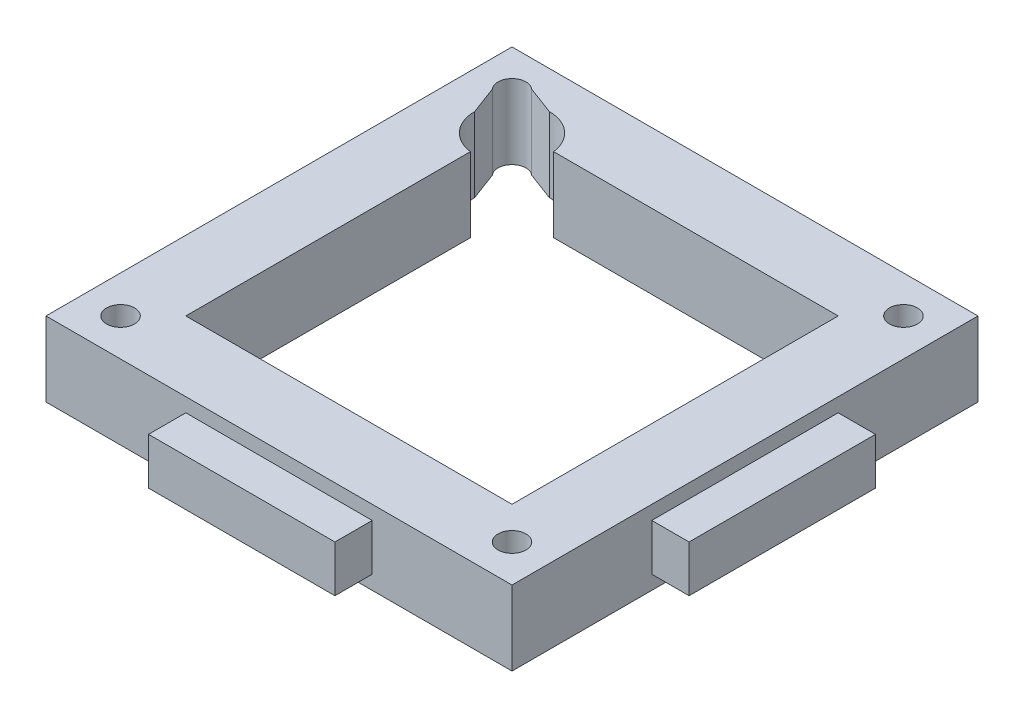
ISO-10303-21;
HEADER;
FILE_DESCRIPTION(('STEP AP214'),'2;1');
FILE_NAME('part.step','',(''),(''),'','','');
FILE_SCHEMA(('AUTOMOTIVE_DESIGN { 1 0 10303 214 1 1 1 1 }'));
ENDSEC;
DATA;
#1=APPLICATION_CONTEXT('core data for automotive mechanical design processes');
#2=APPLICATION_PROTOCOL_DEFINITION('international standard','automotive_design',2000,#1);
#3=PRODUCT_CONTEXT('',#1,'mechanical');
#4=PRODUCT('Part','Part','',(#3));
#5=PRODUCT_RELATED_PRODUCT_CATEGORY('part','',(#4));
#6=PRODUCT_DEFINITION_FORMATION('','',#4);
#7=PRODUCT_DEFINITION_CONTEXT('part definition',#1,'design');
#8=PRODUCT_DEFINITION('design','',#6,#7);
#9=PRODUCT_DEFINITION_SHAPE('','',#8);
#10=(LENGTH_UNIT() NAMED_UNIT(*) SI_UNIT(.MILLI.,.METRE.));
#11=(NAMED_UNIT(*) PLANE_ANGLE_UNIT() SI_UNIT($,.RADIAN.));
#12=(NAMED_UNIT(*) SI_UNIT($,.STERADIAN.) SOLID_ANGLE_UNIT());
#13=UNCERTAINTY_MEASURE_WITH_UNIT(LENGTH_MEASURE(1.E-05),#10,'distance_accuracy_value','');
#14=(GEOMETRIC_REPRESENTATION_CONTEXT(3) GLOBAL_UNCERTAINTY_ASSIGNED_CONTEXT((#13)) GLOBAL_UNIT_ASSIGNED_CONTEXT((#10,
#11,#12)) REPRESENTATION_CONTEXT('',''));
#15=CARTESIAN_POINT('',(0.,0.,0.));
#16=DIRECTION('',(0.,0.,1.));
#17=DIRECTION('',(1.,0.,0.));
#18=AXIS2_PLACEMENT_3D('',#15,#16,#17);
#19=CARTESIAN_POINT('',(25.,8.,0.));
#20=DIRECTION('',(-1.,0.,0.));
#21=DIRECTION('',(0.,0.,1.));
#22=AXIS2_PLACEMENT_3D('',#19,#20,#21);
#23=PLANE('',#22);
#24=DIRECTION('',(0.,0.,-1.));
#25=VECTOR('',#24,1.);
#26=CARTESIAN_POINT('',(25.,0.,0.));
#27=LINE('',#26,#25);
#28=CARTESIAN_POINT('',(25.,0.,25.));
#29=VERTEX_POINT('',#28);
#30=CARTESIAN_POINT('',(25.,0.,-25.));
#31=VERTEX_POINT('',#30);
#32=EDGE_CURVE('E370',#29,#31,#27,.T.);
#33=ORIENTED_EDGE('',*,*,#32,.T.);
#34=DIRECTION('',(0.,-1.,0.));
#35=VECTOR('',#34,1.);
#36=CARTESIAN_POINT('',(25.,8.,-25.));
#37=LINE('',#36,#35);
#38=CARTESIAN_POINT('',(25.,8.,-25.));
#39=VERTEX_POINT('',#38);
#40=EDGE_CURVE('E59',#39,#31,#37,.T.);
#41=ORIENTED_EDGE('',*,*,#40,.F.);
#42=DIRECTION('',(0.,0.,-1.));
#43=VECTOR('',#42,1.);
#44=CARTESIAN_POINT('',(25.,8.,0.));
#45=LINE('',#44,#43);
#46=CARTESIAN_POINT('',(25.,8.,25.));
#47=VERTEX_POINT('',#46);
#48=EDGE_CURVE('E310',#47,#39,#45,.T.);
#49=ORIENTED_EDGE('',*,*,#48,.F.);
#50=DIRECTION('',(0.,-1.,0.));
#51=VECTOR('',#50,1.);
#52=CARTESIAN_POINT('',(25.,8.,25.));
#53=LINE('',#52,#51);
#54=EDGE_CURVE('E11',#47,#29,#53,.T.);
#55=ORIENTED_EDGE('',*,*,#54,.T.);
#56=EDGE_LOOP('',(#33,#41,#49,#55));
#57=FACE_BOUND('',#56,.T.);
#58=DIRECTION('',(0.,0.,-1.));
#59=VECTOR('',#58,1.);
#60=CARTESIAN_POINT('',(25.,1.50000000000004,0.));
#61=LINE('',#60,#59);
#62=CARTESIAN_POINT('',(25.,1.5,10.));
#63=VERTEX_POINT('',#62);
#64=CARTESIAN_POINT('',(25.,1.50000000000007,-10.));
#65=VERTEX_POINT('',#64);
#66=EDGE_CURVE('E67',#63,#65,#61,.T.);
#67=ORIENTED_EDGE('',*,*,#66,.F.);
#68=DIRECTION('',(0.,-1.,0.));
#69=VECTOR('',#68,1.);
#70=CARTESIAN_POINT('',(25.,8.,10.));
#71=LINE('',#70,#69);
#72=CARTESIAN_POINT('',(25.,6.5,10.));
#73=VERTEX_POINT('',#72);
#74=EDGE_CURVE('E71',#73,#63,#71,.T.);
#75=ORIENTED_EDGE('',*,*,#74,.F.);
#76=DIRECTION('',(0.,0.,1.));
#77=VECTOR('',#76,1.);
#78=CARTESIAN_POINT('',(25.,6.5,0.));
#79=LINE('',#78,#77);
#80=CARTESIAN_POINT('',(25.,6.5,-10.));
#81=VERTEX_POINT('',#80);
#82=EDGE_CURVE('E858',#81,#73,#79,.T.);
#83=ORIENTED_EDGE('',*,*,#82,.F.);
#84=DIRECTION('',(0.,1.,0.));
#85=VECTOR('',#84,1.);
#86=CARTESIAN_POINT('',(25.,8.,-10.));
#87=LINE('',#86,#85);
#88=EDGE_CURVE('E868',#65,#81,#87,.T.);
#89=ORIENTED_EDGE('',*,*,#88,.F.);
#90=EDGE_LOOP('',(#67,#75,#83,#89));
#91=FACE_BOUND('',#90,.T.);
#92=ADVANCED_FACE('F49',(#57,#91),#23,.F.);
#93=CARTESIAN_POINT('',(0.,8.,25.));
#94=DIRECTION('',(0.,0.,-1.));
#95=DIRECTION('',(-1.,0.,0.));
#96=AXIS2_PLACEMENT_3D('',#93,#94,#95);
#97=PLANE('',#96);
#98=DIRECTION('',(1.,0.,0.));
#99=VECTOR('',#98,1.);
#100=CARTESIAN_POINT('',(0.,0.,25.));
#101=LINE('',#100,#99);
#102=CARTESIAN_POINT('',(-25.,0.,25.));
#103=VERTEX_POINT('',#102);
#104=EDGE_CURVE('E366',#103,#29,#101,.T.);
#105=ORIENTED_EDGE('',*,*,#104,.T.);
#106=ORIENTED_EDGE('',*,*,#54,.F.);
#107=DIRECTION('',(1.,0.,0.));
#108=VECTOR('',#107,1.);
#109=CARTESIAN_POINT('',(0.,8.,25.));
#110=LINE('',#109,#108);
#111=CARTESIAN_POINT('',(-25.,8.,25.));
#112=VERTEX_POINT('',#111);
#113=EDGE_CURVE('E306',#112,#47,#110,.T.);
#114=ORIENTED_EDGE('',*,*,#113,.F.);
#115=DIRECTION('',(0.,-1.,0.));
#116=VECTOR('',#115,1.);
#117=CARTESIAN_POINT('',(-25.,8.,25.));
#118=LINE('',#117,#116);
#119=EDGE_CURVE('E389',#112,#103,#118,.T.);
#120=ORIENTED_EDGE('',*,*,#119,.T.);
#121=EDGE_LOOP('',(#105,#106,#114,#120));
#122=FACE_BOUND('',#121,.T.);
#123=DIRECTION('',(1.,0.,0.));
#124=VECTOR('',#123,1.);
#125=CARTESIAN_POINT('',(0.,1.5000000000053,25.));
#126=LINE('',#125,#124);
#127=CARTESIAN_POINT('',(-10.0000000000553,1.5000000000053,25.));
#128=VERTEX_POINT('',#127);
#129=CARTESIAN_POINT('',(9.9999999999447,1.5000000000053,25.));
#130=VERTEX_POINT('',#129);
#131=EDGE_CURVE('E218',#128,#130,#126,.T.);
#132=ORIENTED_EDGE('',*,*,#131,.F.);
#133=DIRECTION('',(0.,-1.,0.));
#134=VECTOR('',#133,1.);
#135=CARTESIAN_POINT('',(-10.0000000000553,8.,25.));
#136=LINE('',#135,#134);
#137=CARTESIAN_POINT('',(-10.0000000000553,6.5000000000053,25.));
#138=VERTEX_POINT('',#137);
#139=EDGE_CURVE('E234',#138,#128,#136,.T.);
#140=ORIENTED_EDGE('',*,*,#139,.F.);
#141=DIRECTION('',(-1.,0.,0.));
#142=VECTOR('',#141,1.);
#143=CARTESIAN_POINT('',(0.,6.5000000000053,25.));
#144=LINE('',#143,#142);
#145=CARTESIAN_POINT('',(9.9999999999447,6.5000000000053,25.));
#146=VERTEX_POINT('',#145);
#147=EDGE_CURVE('E247',#146,#138,#144,.T.);
#148=ORIENTED_EDGE('',*,*,#147,.F.);
#149=DIRECTION('',(0.,1.,0.));
#150=VECTOR('',#149,1.);
#151=CARTESIAN_POINT('',(9.9999999999447,8.,25.));
#152=LINE('',#151,#150);
#153=EDGE_CURVE('E223',#130,#146,#152,.T.);
#154=ORIENTED_EDGE('',*,*,#153,.F.);
#155=EDGE_LOOP('',(#132,#140,#148,#154));
#156=FACE_BOUND('',#155,.T.);
#157=ADVANCED_FACE('F477',(#122,#156),#97,.F.);
#158=CARTESIAN_POINT('',(0.,8.,-25.));
#159=DIRECTION('',(0.,0.,-1.));
#160=DIRECTION('',(-1.,0.,0.));
#161=AXIS2_PLACEMENT_3D('',#158,#159,#160);
#162=PLANE('',#161);
#163=DIRECTION('',(1.,0.,0.));
#164=VECTOR('',#163,1.);
#165=CARTESIAN_POINT('',(0.,0.,-25.));
#166=LINE('',#165,#164);
#167=CARTESIAN_POINT('',(-25.,0.,-25.));
#168=VERTEX_POINT('',#167);
#169=EDGE_CURVE('E374',#168,#31,#166,.T.);
#170=ORIENTED_EDGE('',*,*,#169,.F.);
#171=DIRECTION('',(0.,-1.,0.));
#172=VECTOR('',#171,1.);
#173=CARTESIAN_POINT('',(-25.,8.,-25.));
#174=LINE('',#173,#172);
#175=CARTESIAN_POINT('',(-25.,8.,-25.));
#176=VERTEX_POINT('',#175);
#177=EDGE_CURVE('E392',#176,#168,#174,.T.);
#178=ORIENTED_EDGE('',*,*,#177,.F.);
#179=DIRECTION('',(1.,0.,0.));
#180=VECTOR('',#179,1.);
#181=CARTESIAN_POINT('',(0.,8.,-25.));
#182=LINE('',#181,#180);
#183=EDGE_CURVE('E313',#176,#39,#182,.T.);
#184=ORIENTED_EDGE('',*,*,#183,.T.);
#185=ORIENTED_EDGE('',*,*,#40,.T.);
#186=EDGE_LOOP('',(#170,#178,#184,#185));
#187=FACE_BOUND('',#186,.T.);
#188=ADVANCED_FACE('F475',(#187),#162,.T.);
#189=CARTESIAN_POINT('',(-17.,8.,-17.));
#190=DIRECTION('',(0.,-1.,0.));
#191=DIRECTION('',(0.,0.,-1.));
#192=AXIS2_PLACEMENT_3D('',#189,#190,#191);
#193=CYLINDRICAL_SURFACE('',#192,4.);
#194=CARTESIAN_POINT('',(-17.,0.,-17.));
#195=DIRECTION('',(0.,1.,0.));
#196=DIRECTION('',(0.,0.,1.));
#197=AXIS2_PLACEMENT_3D('',#194,#195,#196);
#198=CIRCLE('',#197,4.);
#199=CARTESIAN_POINT('',(-13.0313730334031,0.,-17.5));
#200=VERTEX_POINT('',#199);
#201=CARTESIAN_POINT('',(-17.,0.,-21.));
#202=VERTEX_POINT('',#201);
#203=EDGE_CURVE('E269',#200,#202,#198,.T.);
#204=ORIENTED_EDGE('',*,*,#203,.F.);
#205=DIRECTION('',(0.,-1.,0.));
#206=VECTOR('',#205,1.);
#207=CARTESIAN_POINT('',(-13.0313730334031,8.,-17.5));
#208=LINE('',#207,#206);
#209=CARTESIAN_POINT('',(-13.0313730334031,8.,-17.5));
#210=VERTEX_POINT('',#209);
#211=EDGE_CURVE('E53',#210,#200,#208,.T.);
#212=ORIENTED_EDGE('',*,*,#211,.F.);
#213=CARTESIAN_POINT('',(-17.,8.,-17.));
#214=DIRECTION('',(0.,1.,0.));
#215=DIRECTION('',(0.,0.,1.));
#216=AXIS2_PLACEMENT_3D('',#213,#214,#215);
#217=CIRCLE('',#216,4.);
#218=CARTESIAN_POINT('',(-17.,8.,-21.));
#219=VERTEX_POINT('',#218);
#220=EDGE_CURVE('E270',#210,#219,#217,.T.);
#221=ORIENTED_EDGE('',*,*,#220,.T.);
#222=DIRECTION('',(0.,-1.,0.));
#223=VECTOR('',#222,1.);
#224=CARTESIAN_POINT('',(-17.,8.,-21.));
#225=LINE('',#224,#223);
#226=EDGE_CURVE('E329',#219,#202,#225,.T.);
#227=ORIENTED_EDGE('',*,*,#226,.T.);
#228=EDGE_LOOP('',(#204,#212,#221,#227));
#229=FACE_BOUND('',#228,.T.);
#230=ADVANCED_FACE('F427',(#229),#193,.F.);
#231=CARTESIAN_POINT('',(0.,8.,-17.5));
#232=DIRECTION('',(0.,0.,1.));
#233=DIRECTION('',(1.,0.,0.));
#234=AXIS2_PLACEMENT_3D('',#231,#232,#233);
#235=PLANE('',#234);
#236=DIRECTION('',(-1.,0.,0.));
#237=VECTOR('',#236,1.);
#238=CARTESIAN_POINT('',(0.,0.,-17.5));
#239=LINE('',#238,#237);
#240=CARTESIAN_POINT('',(17.5,0.,-17.5));
#241=VERTEX_POINT('',#240);
#242=EDGE_CURVE('E333',#241,#200,#239,.T.);
#243=ORIENTED_EDGE('',*,*,#242,.F.);
#244=DIRECTION('',(0.,-1.,0.));
#245=VECTOR('',#244,1.);
#246=CARTESIAN_POINT('',(17.5,8.,-17.5));
#247=LINE('',#246,#245);
#248=CARTESIAN_POINT('',(17.5,8.,-17.5));
#249=VERTEX_POINT('',#248);
#250=EDGE_CURVE('E416',#249,#241,#247,.T.);
#251=ORIENTED_EDGE('',*,*,#250,.F.);
#252=DIRECTION('',(-1.,0.,0.));
#253=VECTOR('',#252,1.);
#254=CARTESIAN_POINT('',(0.,8.,-17.5));
#255=LINE('',#254,#253);
#256=EDGE_CURVE('E274',#249,#210,#255,.T.);
#257=ORIENTED_EDGE('',*,*,#256,.T.);
#258=ORIENTED_EDGE('',*,*,#211,.T.);
#259=EDGE_LOOP('',(#243,#251,#257,#258));
#260=FACE_BOUND('',#259,.T.);
#261=ADVANCED_FACE('F51',(#260),#235,.T.);
#262=CARTESIAN_POINT('',(17.5,8.,0.));
#263=DIRECTION('',(-1.,0.,0.));
#264=DIRECTION('',(0.,0.,1.));
#265=AXIS2_PLACEMENT_3D('',#262,#263,#264);
#266=PLANE('',#265);
#267=DIRECTION('',(0.,0.,-1.));
#268=VECTOR('',#267,1.);
#269=CARTESIAN_POINT('',(17.5,0.,0.));
#270=LINE('',#269,#268);
#271=CARTESIAN_POINT('',(17.5,0.,17.5));
#272=VERTEX_POINT('',#271);
#273=EDGE_CURVE('E338',#272,#241,#270,.T.);
#274=ORIENTED_EDGE('',*,*,#273,.F.);
#275=DIRECTION('',(0.,-1.,0.));
#276=VECTOR('',#275,1.);
#277=CARTESIAN_POINT('',(17.5,8.,17.5));
#278=LINE('',#277,#276);
#279=CARTESIAN_POINT('',(17.5,8.,17.5));
#280=VERTEX_POINT('',#279);
#281=EDGE_CURVE('E414',#280,#272,#278,.T.);
#282=ORIENTED_EDGE('',*,*,#281,.F.);
#283=DIRECTION('',(0.,0.,-1.));
#284=VECTOR('',#283,1.);
#285=CARTESIAN_POINT('',(17.5,8.,0.));
#286=LINE('',#285,#284);
#287=EDGE_CURVE('E280',#280,#249,#286,.T.);
#288=ORIENTED_EDGE('',*,*,#287,.T.);
#289=ORIENTED_EDGE('',*,*,#250,.T.);
#290=EDGE_LOOP('',(#274,#282,#288,#289));
#291=FACE_BOUND('',#290,.T.);
#292=ADVANCED_FACE('F435',(#291),#266,.T.);
#293=CARTESIAN_POINT('',(0.,8.,17.5));
#294=DIRECTION('',(0.,0.,-1.));
#295=DIRECTION('',(-1.,0.,0.));
#296=AXIS2_PLACEMENT_3D('',#293,#294,#295);
#297=PLANE('',#296);
#298=DIRECTION('',(1.,0.,0.));
#299=VECTOR('',#298,1.);
#300=CARTESIAN_POINT('',(0.,0.,17.5));
#301=LINE('',#300,#299);
#302=CARTESIAN_POINT('',(-17.5,0.,17.5));
#303=VERTEX_POINT('',#302);
#304=EDGE_CURVE('E342',#303,#272,#301,.T.);
#305=ORIENTED_EDGE('',*,*,#304,.F.);
#306=DIRECTION('',(0.,-1.,0.));
#307=VECTOR('',#306,1.);
#308=CARTESIAN_POINT('',(-17.5,8.,17.5));
#309=LINE('',#308,#307);
#310=CARTESIAN_POINT('',(-17.5,8.,17.5));
#311=VERTEX_POINT('',#310);
#312=EDGE_CURVE('E411',#311,#303,#309,.T.);
#313=ORIENTED_EDGE('',*,*,#312,.F.);
#314=DIRECTION('',(1.,0.,0.));
#315=VECTOR('',#314,1.);
#316=CARTESIAN_POINT('',(0.,8.,17.5));
#317=LINE('',#316,#315);
#318=EDGE_CURVE('E284',#311,#280,#317,.T.);
#319=ORIENTED_EDGE('',*,*,#318,.T.);
#320=ORIENTED_EDGE('',*,*,#281,.T.);
#321=EDGE_LOOP('',(#305,#313,#319,#320));
#322=FACE_BOUND('',#321,.T.);
#323=ADVANCED_FACE('F442',(#322),#297,.T.);
#324=CARTESIAN_POINT('',(-17.5,8.,0.));
#325=DIRECTION('',(-1.,0.,0.));
#326=DIRECTION('',(0.,0.,1.));
#327=AXIS2_PLACEMENT_3D('',#324,#325,#326);
#328=PLANE('',#327);
#329=DIRECTION('',(0.,0.,-1.));
#330=VECTOR('',#329,1.);
#331=CARTESIAN_POINT('',(-17.5,0.,0.));
#332=LINE('',#331,#330);
#333=CARTESIAN_POINT('',(-17.5,0.,-13.0313730334031));
#334=VERTEX_POINT('',#333);
#335=EDGE_CURVE('E346',#303,#334,#332,.T.);
#336=ORIENTED_EDGE('',*,*,#335,.T.);
#337=DIRECTION('',(0.,-1.,0.));
#338=VECTOR('',#337,1.);
#339=CARTESIAN_POINT('',(-17.5,8.,-13.0313730334031));
#340=LINE('',#339,#338);
#341=CARTESIAN_POINT('',(-17.5,8.,-13.0313730334031));
#342=VERTEX_POINT('',#341);
#343=EDGE_CURVE('E408',#342,#334,#340,.T.);
#344=ORIENTED_EDGE('',*,*,#343,.F.);
#345=DIRECTION('',(0.,0.,-1.));
#346=VECTOR('',#345,1.);
#347=CARTESIAN_POINT('',(-17.5,8.,0.));
#348=LINE('',#347,#346);
#349=EDGE_CURVE('E288',#311,#342,#348,.T.);
#350=ORIENTED_EDGE('',*,*,#349,.F.);
#351=ORIENTED_EDGE('',*,*,#312,.T.);
#352=EDGE_LOOP('',(#336,#344,#350,#351));
#353=FACE_BOUND('',#352,.T.);
#354=ADVANCED_FACE('F446',(#353),#328,.F.);
#355=CARTESIAN_POINT('',(-21.,0.,-17.));
#356=VERTEX_POINT('',#355);
#357=EDGE_CURVE('E334',#356,#334,#198,.T.);
#358=ORIENTED_EDGE('',*,*,#357,.F.);
#359=DIRECTION('',(0.,-1.,0.));
#360=VECTOR('',#359,1.);
#361=CARTESIAN_POINT('',(-21.,8.,-17.));
#362=LINE('',#361,#360);
#363=CARTESIAN_POINT('',(-21.,8.,-17.));
#364=VERTEX_POINT('',#363);
#365=EDGE_CURVE('E405',#364,#356,#362,.T.);
#366=ORIENTED_EDGE('',*,*,#365,.F.);
#367=EDGE_CURVE('E276',#364,#342,#217,.T.);
#368=ORIENTED_EDGE('',*,*,#367,.T.);
#369=ORIENTED_EDGE('',*,*,#343,.T.);
#370=EDGE_LOOP('',(#358,#366,#368,#369));
#371=FACE_BOUND('',#370,.T.);
#372=ADVANCED_FACE('F465',(#371),#193,.F.);
#373=CARTESIAN_POINT('',(-12.8219178082192,8.,4.80821917808219));
#374=DIRECTION('',(0.936329177569045,0.,-0.351123441588392));
#375=DIRECTION('',(-0.351123441588392,0.,-0.936329177569045));
#376=AXIS2_PLACEMENT_3D('',#373,#374,#375);
#377=PLANE('',#376);
#378=DIRECTION('',(0.351123441588392,0.,0.936329177569044));
#379=VECTOR('',#378,1.);
#380=CARTESIAN_POINT('',(-12.8219178082192,0.,4.80821917808219));
#381=LINE('',#380,#379);
#382=CARTESIAN_POINT('',(-22.1301369863014,0.,-20.013698630137));
#383=VERTEX_POINT('',#382);
#384=EDGE_CURVE('E350',#383,#356,#381,.T.);
#385=ORIENTED_EDGE('',*,*,#384,.F.);
#386=DIRECTION('',(0.,-1.,0.));
#387=VECTOR('',#386,1.);
#388=CARTESIAN_POINT('',(-22.1301369863014,8.,-20.013698630137));
#389=LINE('',#388,#387);
#390=CARTESIAN_POINT('',(-22.1301369863014,8.,-20.013698630137));
#391=VERTEX_POINT('',#390);
#392=EDGE_CURVE('E402',#391,#383,#389,.T.);
#393=ORIENTED_EDGE('',*,*,#392,.F.);
#394=DIRECTION('',(0.351123441588392,0.,0.936329177569044));
#395=VECTOR('',#394,1.);
#396=CARTESIAN_POINT('',(-12.8219178082192,8.,4.80821917808219));
#397=LINE('',#396,#395);
#398=EDGE_CURVE('E291',#391,#364,#397,.T.);
#399=ORIENTED_EDGE('',*,*,#398,.T.);
#400=ORIENTED_EDGE('',*,*,#365,.T.);
#401=EDGE_LOOP('',(#385,#393,#399,#400));
#402=FACE_BOUND('',#401,.T.);
#403=ADVANCED_FACE('F455',(#402),#377,.T.);
#404=CARTESIAN_POINT('',(-21.,8.,-21.));
#405=DIRECTION('',(0.,-1.,0.));
#406=DIRECTION('',(0.,0.,-1.));
#407=AXIS2_PLACEMENT_3D('',#404,#405,#406);
#408=CYLINDRICAL_SURFACE('',#407,1.5);
#409=CARTESIAN_POINT('',(-21.,0.,-21.));
#410=DIRECTION('',(0.,1.,0.));
#411=DIRECTION('',(0.,0.,1.));
#412=AXIS2_PLACEMENT_3D('',#409,#410,#411);
#413=CIRCLE('',#412,1.5);
#414=CARTESIAN_POINT('',(-20.013698630137,0.,-22.1301369863014));
#415=VERTEX_POINT('',#414);
#416=EDGE_CURVE('E354',#415,#383,#413,.T.);
#417=ORIENTED_EDGE('',*,*,#416,.F.);
#418=DIRECTION('',(0.,-1.,0.));
#419=VECTOR('',#418,1.);
#420=CARTESIAN_POINT('',(-20.013698630137,8.,-22.1301369863014));
#421=LINE('',#420,#419);
#422=CARTESIAN_POINT('',(-20.013698630137,8.,-22.1301369863014));
#423=VERTEX_POINT('',#422);
#424=EDGE_CURVE('E399',#423,#415,#421,.T.);
#425=ORIENTED_EDGE('',*,*,#424,.F.);
#426=CARTESIAN_POINT('',(-21.,8.,-21.));
#427=DIRECTION('',(0.,1.,0.));
#428=DIRECTION('',(0.,0.,1.));
#429=AXIS2_PLACEMENT_3D('',#426,#427,#428);
#430=CIRCLE('',#429,1.5);
#431=EDGE_CURVE('E295',#423,#391,#430,.T.);
#432=ORIENTED_EDGE('',*,*,#431,.T.);
#433=ORIENTED_EDGE('',*,*,#392,.T.);
#434=EDGE_LOOP('',(#417,#425,#432,#433));
#435=FACE_BOUND('',#434,.T.);
#436=ADVANCED_FACE('F459',(#435),#408,.F.);
#437=CARTESIAN_POINT('',(21.,8.,21.));
#438=DIRECTION('',(0.,-1.,0.));
#439=DIRECTION('',(0.,0.,-1.));
#440=AXIS2_PLACEMENT_3D('',#437,#438,#439);
#441=CYLINDRICAL_SURFACE('',#440,1.5);
#442=CARTESIAN_POINT('',(21.,8.,21.));
#443=DIRECTION('',(0.,1.,0.));
#444=DIRECTION('',(0.,0.,1.));
#445=AXIS2_PLACEMENT_3D('',#442,#443,#444);
#446=CIRCLE('',#445,1.5);
#447=CARTESIAN_POINT('',(21.,8.,22.5));
#448=VERTEX_POINT('',#447);
#449=EDGE_CURVE('E321',#448,#448,#446,.T.);
#450=ORIENTED_EDGE('',*,*,#449,.T.);
#451=EDGE_LOOP('',(#450));
#452=FACE_BOUND('',#451,.T.);
#453=CARTESIAN_POINT('',(21.,0.,21.));
#454=DIRECTION('',(0.,1.,0.));
#455=DIRECTION('',(0.,0.,1.));
#456=AXIS2_PLACEMENT_3D('',#453,#454,#455);
#457=CIRCLE('',#456,1.5);
#458=CARTESIAN_POINT('',(21.,0.,22.5));
#459=VERTEX_POINT('',#458);
#460=EDGE_CURVE('E382',#459,#459,#457,.T.);
#461=ORIENTED_EDGE('',*,*,#460,.F.);
#462=EDGE_LOOP('',(#461));
#463=FACE_BOUND('',#462,.T.);
#464=ADVANCED_FACE('F499',(#452,#463),#441,.F.);
#465=CARTESIAN_POINT('',(-25.,8.,0.));
#466=DIRECTION('',(-1.,0.,0.));
#467=DIRECTION('',(0.,0.,1.));
#468=AXIS2_PLACEMENT_3D('',#465,#466,#467);
#469=PLANE('',#468);
#470=DIRECTION('',(0.,0.,-1.));
#471=VECTOR('',#470,1.);
#472=CARTESIAN_POINT('',(-25.,0.,0.));
#473=LINE('',#472,#471);
#474=EDGE_CURVE('E378',#103,#168,#473,.T.);
#475=ORIENTED_EDGE('',*,*,#474,.F.);
#476=ORIENTED_EDGE('',*,*,#119,.F.);
#477=DIRECTION('',(0.,0.,-1.));
#478=VECTOR('',#477,1.);
#479=CARTESIAN_POINT('',(-25.,8.,0.));
#480=LINE('',#479,#478);
#481=EDGE_CURVE('E317',#112,#176,#480,.T.);
#482=ORIENTED_EDGE('',*,*,#481,.T.);
#483=ORIENTED_EDGE('',*,*,#177,.T.);
#484=EDGE_LOOP('',(#475,#476,#482,#483));
#485=FACE_BOUND('',#484,.T.);
#486=ADVANCED_FACE('F493',(#485),#469,.T.);
#487=CARTESIAN_POINT('',(21.,8.,-21.));
#488=DIRECTION('',(0.,-1.,0.));
#489=DIRECTION('',(0.,0.,-1.));
#490=AXIS2_PLACEMENT_3D('',#487,#488,#489);
#491=CYLINDRICAL_SURFACE('',#490,1.5);
#492=CARTESIAN_POINT('',(21.,8.,-21.));
#493=DIRECTION('',(0.,1.,0.));
#494=DIRECTION('',(0.,0.,1.));
#495=AXIS2_PLACEMENT_3D('',#492,#493,#494);
#496=CIRCLE('',#495,1.5);
#497=CARTESIAN_POINT('',(21.,8.,-19.5));
#498=VERTEX_POINT('',#497);
#499=EDGE_CURVE('E302',#498,#498,#496,.F.);
#500=ORIENTED_EDGE('',*,*,#499,.F.);
#501=EDGE_LOOP('',(#500));
#502=FACE_BOUND('',#501,.T.);
#503=CARTESIAN_POINT('',(21.,0.,-21.));
#504=DIRECTION('',(0.,1.,0.));
#505=DIRECTION('',(0.,0.,1.));
#506=AXIS2_PLACEMENT_3D('',#503,#504,#505);
#507=CIRCLE('',#506,1.5);
#508=CARTESIAN_POINT('',(21.,0.,-19.5));
#509=VERTEX_POINT('',#508);
#510=EDGE_CURVE('E362',#509,#509,#507,.F.);
#511=ORIENTED_EDGE('',*,*,#510,.T.);
#512=EDGE_LOOP('',(#511));
#513=FACE_BOUND('',#512,.T.);
#514=ADVANCED_FACE('F490',(#502,#513),#491,.F.);
#515=CARTESIAN_POINT('',(4.80821917808219,8.,-12.8219178082192));
#516=DIRECTION('',(0.351123441588392,0.,-0.936329177569045));
#517=DIRECTION('',(-0.936329177569045,0.,-0.351123441588392));
#518=AXIS2_PLACEMENT_3D('',#515,#516,#517);
#519=PLANE('',#518);
#520=DIRECTION('',(0.936329177569044,0.,0.351123441588392));
#521=VECTOR('',#520,1.);
#522=CARTESIAN_POINT('',(4.80821917808219,0.,-12.8219178082192));
#523=LINE('',#522,#521);
#524=EDGE_CURVE('E358',#415,#202,#523,.T.);
#525=ORIENTED_EDGE('',*,*,#524,.T.);
#526=ORIENTED_EDGE('',*,*,#226,.F.);
#527=DIRECTION('',(0.936329177569044,0.,0.351123441588392));
#528=VECTOR('',#527,1.);
#529=CARTESIAN_POINT('',(4.80821917808219,8.,-12.8219178082192));
#530=LINE('',#529,#528);
#531=EDGE_CURVE('E299',#423,#219,#530,.T.);
#532=ORIENTED_EDGE('',*,*,#531,.F.);
#533=ORIENTED_EDGE('',*,*,#424,.T.);
#534=EDGE_LOOP('',(#525,#526,#532,#533));
#535=FACE_BOUND('',#534,.T.);
#536=ADVANCED_FACE('F462',(#535),#519,.F.);
#537=CARTESIAN_POINT('',(-21.,8.,21.));
#538=DIRECTION('',(0.,-1.,0.));
#539=DIRECTION('',(0.,0.,-1.));
#540=AXIS2_PLACEMENT_3D('',#537,#538,#539);
#541=CYLINDRICAL_SURFACE('',#540,1.5);
#542=CARTESIAN_POINT('',(-21.,8.,21.));
#543=DIRECTION('',(0.,1.,0.));
#544=DIRECTION('',(0.,0.,1.));
#545=AXIS2_PLACEMENT_3D('',#542,#543,#544);
#546=CIRCLE('',#545,1.5);
#547=CARTESIAN_POINT('',(-21.,8.,22.5));
#548=VERTEX_POINT('',#547);
#549=EDGE_CURVE('E325',#548,#548,#546,.F.);
#550=ORIENTED_EDGE('',*,*,#549,.F.);
#551=EDGE_LOOP('',(#550));
#552=FACE_BOUND('',#551,.T.);
#553=CARTESIAN_POINT('',(-21.,0.,21.));
#554=DIRECTION('',(0.,1.,0.));
#555=DIRECTION('',(0.,0.,1.));
#556=AXIS2_PLACEMENT_3D('',#553,#554,#555);
#557=CIRCLE('',#556,1.5);
#558=CARTESIAN_POINT('',(-21.,0.,22.5));
#559=VERTEX_POINT('',#558);
#560=EDGE_CURVE('E275',#559,#559,#557,.F.);
#561=ORIENTED_EDGE('',*,*,#560,.T.);
#562=EDGE_LOOP('',(#561));
#563=FACE_BOUND('',#562,.T.);
#564=ADVANCED_FACE('F497',(#552,#563),#541,.F.);
#565=CARTESIAN_POINT('',(0.,8.,0.));
#566=DIRECTION('',(0.,1.,0.));
#567=DIRECTION('',(0.,0.,1.));
#568=AXIS2_PLACEMENT_3D('',#565,#566,#567);
#569=PLANE('',#568);
#570=ORIENTED_EDGE('',*,*,#220,.F.);
#571=ORIENTED_EDGE('',*,*,#256,.F.);
#572=ORIENTED_EDGE('',*,*,#287,.F.);
#573=ORIENTED_EDGE('',*,*,#318,.F.);
#574=ORIENTED_EDGE('',*,*,#349,.T.);
#575=ORIENTED_EDGE('',*,*,#367,.F.);
#576=ORIENTED_EDGE('',*,*,#398,.F.);
#577=ORIENTED_EDGE('',*,*,#431,.F.);
#578=ORIENTED_EDGE('',*,*,#531,.T.);
#579=EDGE_LOOP('',(#570,#571,#572,#573,#574,#575,#576,#577,#578));
#580=FACE_BOUND('',#579,.T.);
#581=ORIENTED_EDGE('',*,*,#499,.T.);
#582=EDGE_LOOP('',(#581));
#583=FACE_BOUND('',#582,.T.);
#584=ORIENTED_EDGE('',*,*,#113,.T.);
#585=ORIENTED_EDGE('',*,*,#48,.T.);
#586=ORIENTED_EDGE('',*,*,#183,.F.);
#587=ORIENTED_EDGE('',*,*,#481,.F.);
#588=EDGE_LOOP('',(#584,#585,#586,#587));
#589=FACE_BOUND('',#588,.T.);
#590=ORIENTED_EDGE('',*,*,#449,.F.);
#591=EDGE_LOOP('',(#590));
#592=FACE_BOUND('',#591,.T.);
#593=ORIENTED_EDGE('',*,*,#549,.T.);
#594=EDGE_LOOP('',(#593));
#595=FACE_BOUND('',#594,.T.);
#596=ADVANCED_FACE('F440',(#580,#583,#589,#592,#595),#569,.T.);
#597=CARTESIAN_POINT('',(0.,0.,0.));
#598=DIRECTION('',(0.,1.,0.));
#599=DIRECTION('',(0.,0.,1.));
#600=AXIS2_PLACEMENT_3D('',#597,#598,#599);
#601=PLANE('',#600);
#602=ORIENTED_EDGE('',*,*,#203,.T.);
#603=ORIENTED_EDGE('',*,*,#524,.F.);
#604=ORIENTED_EDGE('',*,*,#416,.T.);
#605=ORIENTED_EDGE('',*,*,#384,.T.);
#606=ORIENTED_EDGE('',*,*,#357,.T.);
#607=ORIENTED_EDGE('',*,*,#335,.F.);
#608=ORIENTED_EDGE('',*,*,#304,.T.);
#609=ORIENTED_EDGE('',*,*,#273,.T.);
#610=ORIENTED_EDGE('',*,*,#242,.T.);
#611=EDGE_LOOP('',(#602,#603,#604,#605,#606,#607,#608,#609,#610));
#612=FACE_BOUND('',#611,.T.);
#613=ORIENTED_EDGE('',*,*,#510,.F.);
#614=EDGE_LOOP('',(#613));
#615=FACE_BOUND('',#614,.T.);
#616=ORIENTED_EDGE('',*,*,#104,.F.);
#617=ORIENTED_EDGE('',*,*,#474,.T.);
#618=ORIENTED_EDGE('',*,*,#169,.T.);
#619=ORIENTED_EDGE('',*,*,#32,.F.);
#620=EDGE_LOOP('',(#616,#617,#618,#619));
#621=FACE_BOUND('',#620,.T.);
#622=ORIENTED_EDGE('',*,*,#460,.T.);
#623=EDGE_LOOP('',(#622));
#624=FACE_BOUND('',#623,.T.);
#625=ORIENTED_EDGE('',*,*,#560,.F.);
#626=EDGE_LOOP('',(#625));
#627=FACE_BOUND('',#626,.T.);
#628=ADVANCED_FACE('F431',(#612,#615,#621,#624,#627),#601,.F.);
#629=CARTESIAN_POINT('',(0.,1.5000000000053,29.));
#630=DIRECTION('',(0.,1.,0.));
#631=DIRECTION('',(0.,0.,1.));
#632=AXIS2_PLACEMENT_3D('',#629,#630,#631);
#633=PLANE('',#632);
#634=ORIENTED_EDGE('',*,*,#131,.T.);
#635=DIRECTION('',(0.,0.,-1.));
#636=VECTOR('',#635,1.);
#637=CARTESIAN_POINT('',(9.9999999999447,1.5000000000053,29.));
#638=LINE('',#637,#636);
#639=CARTESIAN_POINT('',(9.9999999999447,1.5000000000053,29.));
#640=VERTEX_POINT('',#639);
#641=EDGE_CURVE('E265',#640,#130,#638,.T.);
#642=ORIENTED_EDGE('',*,*,#641,.F.);
#643=DIRECTION('',(1.,0.,0.));
#644=VECTOR('',#643,1.);
#645=CARTESIAN_POINT('',(0.,1.5000000000053,29.));
#646=LINE('',#645,#644);
#647=CARTESIAN_POINT('',(-10.0000000000553,1.5000000000053,29.));
#648=VERTEX_POINT('',#647);
#649=EDGE_CURVE('E229',#648,#640,#646,.T.);
#650=ORIENTED_EDGE('',*,*,#649,.F.);
#651=DIRECTION('',(0.,0.,-1.));
#652=VECTOR('',#651,1.);
#653=CARTESIAN_POINT('',(-10.0000000000553,1.5000000000053,29.));
#654=LINE('',#653,#652);
#655=EDGE_CURVE('E242',#648,#128,#654,.T.);
#656=ORIENTED_EDGE('',*,*,#655,.T.);
#657=EDGE_LOOP('',(#634,#642,#650,#656));
#658=FACE_BOUND('',#657,.T.);
#659=ADVANCED_FACE('F516',(#658),#633,.F.);
#660=CARTESIAN_POINT('',(9.9999999999447,8.,29.));
#661=DIRECTION('',(-1.,0.,0.));
#662=DIRECTION('',(0.,0.,1.));
#663=AXIS2_PLACEMENT_3D('',#660,#661,#662);
#664=PLANE('',#663);
#665=ORIENTED_EDGE('',*,*,#153,.T.);
#666=DIRECTION('',(0.,0.,-1.));
#667=VECTOR('',#666,1.);
#668=CARTESIAN_POINT('',(9.9999999999447,6.5000000000053,29.));
#669=LINE('',#668,#667);
#670=CARTESIAN_POINT('',(9.9999999999447,6.5000000000053,29.));
#671=VERTEX_POINT('',#670);
#672=EDGE_CURVE('E261',#671,#146,#669,.T.);
#673=ORIENTED_EDGE('',*,*,#672,.F.);
#674=DIRECTION('',(0.,1.,0.));
#675=VECTOR('',#674,1.);
#676=CARTESIAN_POINT('',(9.9999999999447,8.,29.));
#677=LINE('',#676,#675);
#678=EDGE_CURVE('E233',#640,#671,#677,.T.);
#679=ORIENTED_EDGE('',*,*,#678,.F.);
#680=ORIENTED_EDGE('',*,*,#641,.T.);
#681=EDGE_LOOP('',(#665,#673,#679,#680));
#682=FACE_BOUND('',#681,.T.);
#683=ADVANCED_FACE('F521',(#682),#664,.F.);
#684=CARTESIAN_POINT('',(0.,6.5000000000053,29.));
#685=DIRECTION('',(0.,-1.,0.));
#686=DIRECTION('',(0.,0.,-1.));
#687=AXIS2_PLACEMENT_3D('',#684,#685,#686);
#688=PLANE('',#687);
#689=ORIENTED_EDGE('',*,*,#147,.T.);
#690=DIRECTION('',(0.,0.,-1.));
#691=VECTOR('',#690,1.);
#692=CARTESIAN_POINT('',(-10.0000000000553,6.5000000000053,29.));
#693=LINE('',#692,#691);
#694=CARTESIAN_POINT('',(-10.0000000000553,6.5000000000053,29.));
#695=VERTEX_POINT('',#694);
#696=EDGE_CURVE('E257',#695,#138,#693,.T.);
#697=ORIENTED_EDGE('',*,*,#696,.F.);
#698=DIRECTION('',(-1.,0.,0.));
#699=VECTOR('',#698,1.);
#700=CARTESIAN_POINT('',(0.,6.5000000000053,29.));
#701=LINE('',#700,#699);
#702=EDGE_CURVE('E237',#671,#695,#701,.T.);
#703=ORIENTED_EDGE('',*,*,#702,.F.);
#704=ORIENTED_EDGE('',*,*,#672,.T.);
#705=EDGE_LOOP('',(#689,#697,#703,#704));
#706=FACE_BOUND('',#705,.T.);
#707=ADVANCED_FACE('F525',(#706),#688,.F.);
#708=CARTESIAN_POINT('',(-10.0000000000553,8.,29.));
#709=DIRECTION('',(1.,0.,0.));
#710=DIRECTION('',(0.,0.,-1.));
#711=AXIS2_PLACEMENT_3D('',#708,#709,#710);
#712=PLANE('',#711);
#713=ORIENTED_EDGE('',*,*,#139,.T.);
#714=ORIENTED_EDGE('',*,*,#655,.F.);
#715=DIRECTION('',(0.,-1.,0.));
#716=VECTOR('',#715,1.);
#717=CARTESIAN_POINT('',(-10.0000000000553,8.,29.));
#718=LINE('',#717,#716);
#719=EDGE_CURVE('E240',#695,#648,#718,.T.);
#720=ORIENTED_EDGE('',*,*,#719,.F.);
#721=ORIENTED_EDGE('',*,*,#696,.T.);
#722=EDGE_LOOP('',(#713,#714,#720,#721));
#723=FACE_BOUND('',#722,.T.);
#724=ADVANCED_FACE('F529',(#723),#712,.F.);
#725=CARTESIAN_POINT('',(0.,0.,29.));
#726=DIRECTION('',(0.,0.,1.));
#727=DIRECTION('',(1.,0.,0.));
#728=AXIS2_PLACEMENT_3D('',#725,#726,#727);
#729=PLANE('',#728);
#730=ORIENTED_EDGE('',*,*,#649,.T.);
#731=ORIENTED_EDGE('',*,*,#678,.T.);
#732=ORIENTED_EDGE('',*,*,#702,.T.);
#733=ORIENTED_EDGE('',*,*,#719,.T.);
#734=EDGE_LOOP('',(#730,#731,#732,#733));
#735=FACE_BOUND('',#734,.T.);
#736=ADVANCED_FACE('F533',(#735),#729,.T.);
#737=CARTESIAN_POINT('',(29.,1.50000000000004,0.));
#738=DIRECTION('',(0.,1.,0.));
#739=DIRECTION('',(0.,0.,1.));
#740=AXIS2_PLACEMENT_3D('',#737,#738,#739);
#741=PLANE('',#740);
#742=ORIENTED_EDGE('',*,*,#66,.T.);
#743=DIRECTION('',(-1.,0.,0.));
#744=VECTOR('',#743,1.);
#745=CARTESIAN_POINT('',(29.,1.50000000000007,-10.));
#746=LINE('',#745,#744);
#747=CARTESIAN_POINT('',(29.,1.50000000000007,-10.));
#748=VERTEX_POINT('',#747);
#749=EDGE_CURVE('E198',#748,#65,#746,.T.);
#750=ORIENTED_EDGE('',*,*,#749,.F.);
#751=DIRECTION('',(0.,0.,-1.));
#752=VECTOR('',#751,1.);
#753=CARTESIAN_POINT('',(29.,1.50000000000004,0.));
#754=LINE('',#753,#752);
#755=CARTESIAN_POINT('',(29.,1.5,10.));
#756=VERTEX_POINT('',#755);
#757=EDGE_CURVE('E205',#756,#748,#754,.T.);
#758=ORIENTED_EDGE('',*,*,#757,.F.);
#759=DIRECTION('',(-1.,0.,0.));
#760=VECTOR('',#759,1.);
#761=CARTESIAN_POINT('',(29.,1.5,10.));
#762=LINE('',#761,#760);
#763=EDGE_CURVE('E855',#756,#63,#762,.T.);
#764=ORIENTED_EDGE('',*,*,#763,.T.);
#765=EDGE_LOOP('',(#742,#750,#758,#764));
#766=FACE_BOUND('',#765,.T.);
#767=ADVANCED_FACE('F216',(#766),#741,.F.);
#768=CARTESIAN_POINT('',(29.,8.,-10.));
#769=DIRECTION('',(0.,0.,1.));
#770=DIRECTION('',(1.,0.,0.));
#771=AXIS2_PLACEMENT_3D('',#768,#769,#770);
#772=PLANE('',#771);
#773=ORIENTED_EDGE('',*,*,#88,.T.);
#774=DIRECTION('',(-1.,0.,0.));
#775=VECTOR('',#774,1.);
#776=CARTESIAN_POINT('',(29.,6.5,-10.));
#777=LINE('',#776,#775);
#778=CARTESIAN_POINT('',(29.,6.5,-10.));
#779=VERTEX_POINT('',#778);
#780=EDGE_CURVE('E200',#779,#81,#777,.T.);
#781=ORIENTED_EDGE('',*,*,#780,.F.);
#782=DIRECTION('',(0.,1.,0.));
#783=VECTOR('',#782,1.);
#784=CARTESIAN_POINT('',(29.,8.,-10.));
#785=LINE('',#784,#783);
#786=EDGE_CURVE('E193',#748,#779,#785,.T.);
#787=ORIENTED_EDGE('',*,*,#786,.F.);
#788=ORIENTED_EDGE('',*,*,#749,.T.);
#789=EDGE_LOOP('',(#773,#781,#787,#788));
#790=FACE_BOUND('',#789,.T.);
#791=ADVANCED_FACE('F196',(#790),#772,.F.);
#792=CARTESIAN_POINT('',(29.,6.5,0.));
#793=DIRECTION('',(0.,-1.,0.));
#794=DIRECTION('',(0.,0.,-1.));
#795=AXIS2_PLACEMENT_3D('',#792,#793,#794);
#796=PLANE('',#795);
#797=ORIENTED_EDGE('',*,*,#82,.T.);
#798=DIRECTION('',(-1.,0.,0.));
#799=VECTOR('',#798,1.);
#800=CARTESIAN_POINT('',(29.,6.5,10.));
#801=LINE('',#800,#799);
#802=CARTESIAN_POINT('',(29.,6.5,10.));
#803=VERTEX_POINT('',#802);
#804=EDGE_CURVE('E225',#803,#73,#801,.T.);
#805=ORIENTED_EDGE('',*,*,#804,.F.);
#806=DIRECTION('',(0.,0.,1.));
#807=VECTOR('',#806,1.);
#808=CARTESIAN_POINT('',(29.,6.5,0.));
#809=LINE('',#808,#807);
#810=EDGE_CURVE('E204',#779,#803,#809,.T.);
#811=ORIENTED_EDGE('',*,*,#810,.F.);
#812=ORIENTED_EDGE('',*,*,#780,.T.);
#813=EDGE_LOOP('',(#797,#805,#811,#812));
#814=FACE_BOUND('',#813,.T.);
#815=ADVANCED_FACE('F542',(#814),#796,.F.);
#816=CARTESIAN_POINT('',(29.,8.,10.));
#817=DIRECTION('',(0.,0.,-1.));
#818=DIRECTION('',(-1.,0.,0.));
#819=AXIS2_PLACEMENT_3D('',#816,#817,#818);
#820=PLANE('',#819);
#821=ORIENTED_EDGE('',*,*,#74,.T.);
#822=ORIENTED_EDGE('',*,*,#763,.F.);
#823=DIRECTION('',(0.,-1.,0.));
#824=VECTOR('',#823,1.);
#825=CARTESIAN_POINT('',(29.,8.,10.));
#826=LINE('',#825,#824);
#827=EDGE_CURVE('E210',#803,#756,#826,.T.);
#828=ORIENTED_EDGE('',*,*,#827,.F.);
#829=ORIENTED_EDGE('',*,*,#804,.T.);
#830=EDGE_LOOP('',(#821,#822,#828,#829));
#831=FACE_BOUND('',#830,.T.);
#832=ADVANCED_FACE('F545',(#831),#820,.F.);
#833=CARTESIAN_POINT('',(29.,0.,0.));
#834=DIRECTION('',(1.,0.,0.));
#835=DIRECTION('',(0.,0.,-1.));
#836=AXIS2_PLACEMENT_3D('',#833,#834,#835);
#837=PLANE('',#836);
#838=ORIENTED_EDGE('',*,*,#757,.T.);
#839=ORIENTED_EDGE('',*,*,#786,.T.);
#840=ORIENTED_EDGE('',*,*,#810,.T.);
#841=ORIENTED_EDGE('',*,*,#827,.T.);
#842=EDGE_LOOP('',(#838,#839,#840,#841));
#843=FACE_BOUND('',#842,.T.);
#844=ADVANCED_FACE('F208',(#843),#837,.T.);
#845=CLOSED_SHELL('',(#92,#157,#188,#230,#261,#292,#323,#354,#372,#403,#436,#464,#486,#514,#536,
#564,#596,#628,#659,#683,#707,#724,#736,#767,#791,#815,#832,#844));
#846=MANIFOLD_SOLID_BREP('B2',#845);
#847=ADVANCED_BREP_SHAPE_REPRESENTATION('',(#18,#846),#14);
#848=SHAPE_DEFINITION_REPRESENTATION(#9,#847);
ENDSEC;
END-ISO-10303-21;
